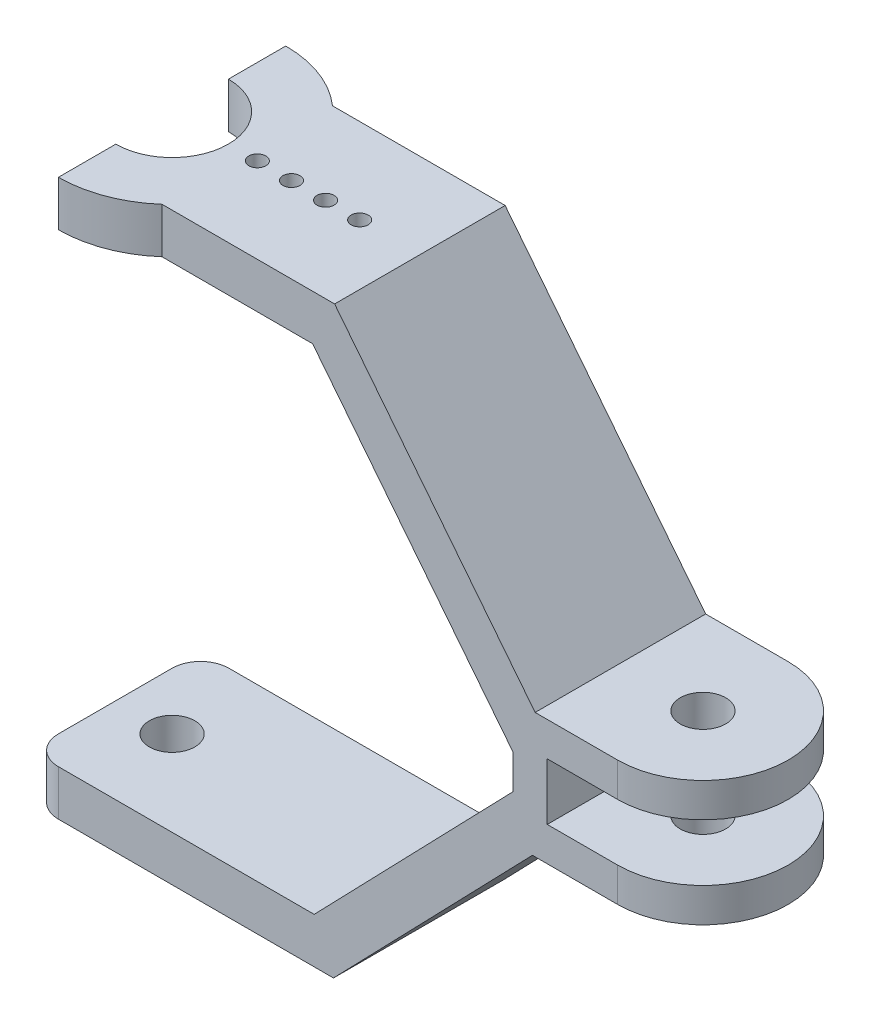
ISO-10303-21;
HEADER;
FILE_DESCRIPTION(('STEP AP214'),'2;1');
FILE_NAME('part.step','',(''),(''),'','','');
FILE_SCHEMA(('AUTOMOTIVE_DESIGN { 1 0 10303 214 1 1 1 1 }'));
ENDSEC;
DATA;
#1=APPLICATION_CONTEXT('core data for automotive mechanical design processes');
#2=APPLICATION_PROTOCOL_DEFINITION('international standard','automotive_design',2000,#1);
#3=PRODUCT_CONTEXT('',#1,'mechanical');
#4=PRODUCT('Part','Part','',(#3));
#5=PRODUCT_RELATED_PRODUCT_CATEGORY('part','',(#4));
#6=PRODUCT_DEFINITION_FORMATION('','',#4);
#7=PRODUCT_DEFINITION_CONTEXT('part definition',#1,'design');
#8=PRODUCT_DEFINITION('design','',#6,#7);
#9=PRODUCT_DEFINITION_SHAPE('','',#8);
#10=(LENGTH_UNIT() NAMED_UNIT(*) SI_UNIT(.MILLI.,.METRE.));
#11=(NAMED_UNIT(*) PLANE_ANGLE_UNIT() SI_UNIT($,.RADIAN.));
#12=(NAMED_UNIT(*) SI_UNIT($,.STERADIAN.) SOLID_ANGLE_UNIT());
#13=UNCERTAINTY_MEASURE_WITH_UNIT(LENGTH_MEASURE(1.E-05),#10,'distance_accuracy_value','');
#14=(GEOMETRIC_REPRESENTATION_CONTEXT(3) GLOBAL_UNCERTAINTY_ASSIGNED_CONTEXT((#13)) GLOBAL_UNIT_ASSIGNED_CONTEXT((#10,
#11,#12)) REPRESENTATION_CONTEXT('',''));
#15=CARTESIAN_POINT('',(0.,0.,0.));
#16=DIRECTION('',(0.,0.,1.));
#17=DIRECTION('',(1.,0.,0.));
#18=AXIS2_PLACEMENT_3D('',#15,#16,#17);
#19=CARTESIAN_POINT('',(-51.6964809757769,0.,15.));
#20=DIRECTION('',(1.,0.,0.));
#21=DIRECTION('',(0.,0.,-1.));
#22=AXIS2_PLACEMENT_3D('',#19,#20,#21);
#23=PLANE('',#22);
#24=DIRECTION('',(0.,0.,-1.));
#25=VECTOR('',#24,1.);
#26=CARTESIAN_POINT('',(-51.6964809757769,0.,15.));
#27=LINE('',#26,#25);
#28=CARTESIAN_POINT('',(-51.6964809757769,0.,12.5));
#29=VERTEX_POINT('',#28);
#30=CARTESIAN_POINT('',(-51.6964809757769,0.,2.5));
#31=VERTEX_POINT('',#30);
#32=EDGE_CURVE('E372',#29,#31,#27,.T.);
#33=ORIENTED_EDGE('',*,*,#32,.F.);
#34=DIRECTION('',(0.,-1.,0.));
#35=VECTOR('',#34,1.);
#36=CARTESIAN_POINT('',(-51.6964809757769,0.,12.5));
#37=LINE('',#36,#35);
#38=CARTESIAN_POINT('',(-51.6964809757769,3.99999999999999,12.5));
#39=VERTEX_POINT('',#38);
#40=EDGE_CURVE('E388',#29,#39,#37,.F.);
#41=ORIENTED_EDGE('',*,*,#40,.T.);
#42=DIRECTION('',(0.,0.,-1.));
#43=VECTOR('',#42,1.);
#44=CARTESIAN_POINT('',(-51.6964809757769,3.99999999999999,15.));
#45=LINE('',#44,#43);
#46=CARTESIAN_POINT('',(-51.6964809757769,3.99999999999999,2.5));
#47=VERTEX_POINT('',#46);
#48=EDGE_CURVE('E307',#39,#47,#45,.T.);
#49=ORIENTED_EDGE('',*,*,#48,.T.);
#50=DIRECTION('',(0.,-1.,0.));
#51=VECTOR('',#50,1.);
#52=CARTESIAN_POINT('',(-51.6964809757769,0.,2.5));
#53=LINE('',#52,#51);
#54=EDGE_CURVE('E385',#47,#31,#53,.T.);
#55=ORIENTED_EDGE('',*,*,#54,.T.);
#56=EDGE_LOOP('',(#33,#41,#49,#55));
#57=FACE_BOUND('',#56,.T.);
#58=ADVANCED_FACE('F35',(#57),#23,.F.);
#59=CARTESIAN_POINT('',(-25.,0.,15.));
#60=DIRECTION('',(0.,1.,0.));
#61=DIRECTION('',(-1.,0.,0.));
#62=AXIS2_PLACEMENT_3D('',#59,#60,#61);
#63=PLANE('',#62);
#64=CARTESIAN_POINT('',(-46.6964809757769,0.,7.5));
#65=DIRECTION('',(0.,-1.,0.));
#66=DIRECTION('',(1.,0.,0.));
#67=AXIS2_PLACEMENT_3D('',#64,#65,#66);
#68=CIRCLE('',#67,2.);
#69=CARTESIAN_POINT('',(-44.6964809757769,0.,7.5));
#70=VERTEX_POINT('',#69);
#71=EDGE_CURVE('E263',#70,#70,#68,.T.);
#72=ORIENTED_EDGE('',*,*,#71,.F.);
#73=EDGE_LOOP('',(#72));
#74=FACE_BOUND('',#73,.T.);
#75=DIRECTION('',(1.,0.,0.));
#76=VECTOR('',#75,1.);
#77=CARTESIAN_POINT('',(-25.,0.,15.));
#78=LINE('',#77,#76);
#79=CARTESIAN_POINT('',(-49.1964809757769,0.,15.));
#80=VERTEX_POINT('',#79);
#81=CARTESIAN_POINT('',(-25.,0.,15.));
#82=VERTEX_POINT('',#81);
#83=EDGE_CURVE('E272',#80,#82,#78,.T.);
#84=ORIENTED_EDGE('',*,*,#83,.F.);
#85=CARTESIAN_POINT('',(-49.1964809757769,0.,12.5));
#86=DIRECTION('',(0.,1.,0.));
#87=DIRECTION('',(-1.,0.,0.));
#88=AXIS2_PLACEMENT_3D('',#85,#86,#87);
#89=CIRCLE('',#88,2.5);
#90=EDGE_CURVE('E383',#80,#29,#89,.F.);
#91=ORIENTED_EDGE('',*,*,#90,.T.);
#92=ORIENTED_EDGE('',*,*,#32,.T.);
#93=CARTESIAN_POINT('',(-49.1964809757769,0.,2.5));
#94=DIRECTION('',(0.,1.,0.));
#95=DIRECTION('',(-1.,0.,0.));
#96=AXIS2_PLACEMENT_3D('',#93,#94,#95);
#97=CIRCLE('',#96,2.5);
#98=CARTESIAN_POINT('',(-49.1964809757769,0.,0.));
#99=VERTEX_POINT('',#98);
#100=EDGE_CURVE('E381',#31,#99,#97,.F.);
#101=ORIENTED_EDGE('',*,*,#100,.T.);
#102=DIRECTION('',(1.,0.,0.));
#103=VECTOR('',#102,1.);
#104=CARTESIAN_POINT('',(-25.,0.,0.));
#105=LINE('',#104,#103);
#106=CARTESIAN_POINT('',(-25.,0.,0.));
#107=VERTEX_POINT('',#106);
#108=EDGE_CURVE('E271',#99,#107,#105,.T.);
#109=ORIENTED_EDGE('',*,*,#108,.T.);
#110=DIRECTION('',(0.,0.,-1.));
#111=VECTOR('',#110,1.);
#112=CARTESIAN_POINT('',(-25.,0.,15.));
#113=LINE('',#112,#111);
#114=EDGE_CURVE('E369',#82,#107,#113,.T.);
#115=ORIENTED_EDGE('',*,*,#114,.F.);
#116=EDGE_LOOP('',(#84,#91,#92,#101,#109,#115));
#117=FACE_BOUND('',#116,.T.);
#118=ADVANCED_FACE('F404',(#74,#117),#63,.F.);
#119=CARTESIAN_POINT('',(-7.5,18.1,15.));
#120=DIRECTION('',(-0.718922211716419,0.695090536189907,0.));
#121=DIRECTION('',(-0.695090536189907,-0.718922211716419,0.));
#122=AXIS2_PLACEMENT_3D('',#119,#120,#121);
#123=PLANE('',#122);
#124=DIRECTION('',(0.695090536189907,0.718922211716419,0.));
#125=VECTOR('',#124,1.);
#126=CARTESIAN_POINT('',(-7.5,18.1,0.));
#127=LINE('',#126,#125);
#128=CARTESIAN_POINT('',(-7.5,18.1,0.));
#129=VERTEX_POINT('',#128);
#130=EDGE_CURVE('E309',#107,#129,#127,.T.);
#131=ORIENTED_EDGE('',*,*,#130,.T.);
#132=DIRECTION('',(0.,0.,-1.));
#133=VECTOR('',#132,1.);
#134=CARTESIAN_POINT('',(-7.5,18.1,15.));
#135=LINE('',#134,#133);
#136=CARTESIAN_POINT('',(-7.5,18.1,15.));
#137=VERTEX_POINT('',#136);
#138=EDGE_CURVE('E367',#137,#129,#135,.T.);
#139=ORIENTED_EDGE('',*,*,#138,.F.);
#140=DIRECTION('',(0.695090536189907,0.718922211716419,0.));
#141=VECTOR('',#140,1.);
#142=CARTESIAN_POINT('',(-7.5,18.1,15.));
#143=LINE('',#142,#141);
#144=EDGE_CURVE('E274',#82,#137,#143,.T.);
#145=ORIENTED_EDGE('',*,*,#144,.F.);
#146=ORIENTED_EDGE('',*,*,#114,.T.);
#147=EDGE_LOOP('',(#131,#139,#145,#146));
#148=FACE_BOUND('',#147,.T.);
#149=ADVANCED_FACE('F415',(#148),#123,.F.);
#150=CARTESIAN_POINT('',(-7.5,18.1,15.));
#151=DIRECTION('',(0.,1.,0.));
#152=DIRECTION('',(0.,0.,1.));
#153=AXIS2_PLACEMENT_3D('',#150,#151,#152);
#154=PLANE('',#153);
#155=CARTESIAN_POINT('',(0.,18.1,7.5));
#156=DIRECTION('',(0.,1.,0.));
#157=DIRECTION('',(0.,0.,1.));
#158=AXIS2_PLACEMENT_3D('',#155,#156,#157);
#159=CIRCLE('',#158,2.);
#160=CARTESIAN_POINT('',(0.,18.1,9.5));
#161=VERTEX_POINT('',#160);
#162=EDGE_CURVE('E242',#161,#161,#159,.T.);
#163=ORIENTED_EDGE('',*,*,#162,.T.);
#164=EDGE_LOOP('',(#163));
#165=FACE_BOUND('',#164,.T.);
#166=ORIENTED_EDGE('',*,*,#138,.T.);
#167=DIRECTION('',(1.,0.,0.));
#168=VECTOR('',#167,1.);
#169=CARTESIAN_POINT('',(-7.5,18.1,0.));
#170=LINE('',#169,#168);
#171=CARTESIAN_POINT('',(0.,18.1,0.));
#172=VERTEX_POINT('',#171);
#173=EDGE_CURVE('E312',#129,#172,#170,.T.);
#174=ORIENTED_EDGE('',*,*,#173,.T.);
#175=CARTESIAN_POINT('',(0.,18.1,7.5));
#176=DIRECTION('',(0.,-1.,0.));
#177=DIRECTION('',(0.,0.,-1.));
#178=AXIS2_PLACEMENT_3D('',#175,#176,#177);
#179=CIRCLE('',#178,7.5);
#180=CARTESIAN_POINT('',(0.,18.1,15.));
#181=VERTEX_POINT('',#180);
#182=EDGE_CURVE('E257',#172,#181,#179,.T.);
#183=ORIENTED_EDGE('',*,*,#182,.T.);
#184=DIRECTION('',(1.,0.,0.));
#185=VECTOR('',#184,1.);
#186=CARTESIAN_POINT('',(-7.5,18.1,15.));
#187=LINE('',#186,#185);
#188=EDGE_CURVE('E277',#137,#181,#187,.T.);
#189=ORIENTED_EDGE('',*,*,#188,.F.);
#190=EDGE_LOOP('',(#166,#174,#183,#189));
#191=FACE_BOUND('',#190,.T.);
#192=ADVANCED_FACE('F425',(#165,#191),#154,.F.);
#193=CARTESIAN_POINT('',(0.,21.1,15.));
#194=DIRECTION('',(0.,-1.,0.));
#195=DIRECTION('',(0.,0.,-1.));
#196=AXIS2_PLACEMENT_3D('',#193,#194,#195);
#197=PLANE('',#196);
#198=CARTESIAN_POINT('',(0.,21.1,7.5));
#199=DIRECTION('',(0.,-1.,0.));
#200=DIRECTION('',(0.,0.,-1.));
#201=AXIS2_PLACEMENT_3D('',#198,#199,#200);
#202=CIRCLE('',#201,2.);
#203=CARTESIAN_POINT('',(0.,21.1,5.5));
#204=VERTEX_POINT('',#203);
#205=EDGE_CURVE('E250',#204,#204,#202,.T.);
#206=ORIENTED_EDGE('',*,*,#205,.T.);
#207=EDGE_LOOP('',(#206));
#208=FACE_BOUND('',#207,.T.);
#209=DIRECTION('',(-1.,0.,0.));
#210=VECTOR('',#209,1.);
#211=CARTESIAN_POINT('',(0.,21.1,0.));
#212=LINE('',#211,#210);
#213=CARTESIAN_POINT('',(0.,21.1,0.));
#214=VERTEX_POINT('',#213);
#215=CARTESIAN_POINT('',(-6.19648097577692,21.1,0.));
#216=VERTEX_POINT('',#215);
#217=EDGE_CURVE('E317',#214,#216,#212,.T.);
#218=ORIENTED_EDGE('',*,*,#217,.T.);
#219=DIRECTION('',(0.,0.,-1.));
#220=VECTOR('',#219,1.);
#221=CARTESIAN_POINT('',(-6.19648097577692,21.1,15.));
#222=LINE('',#221,#220);
#223=CARTESIAN_POINT('',(-6.19648097577692,21.1,15.));
#224=VERTEX_POINT('',#223);
#225=EDGE_CURVE('E365',#224,#216,#222,.T.);
#226=ORIENTED_EDGE('',*,*,#225,.F.);
#227=DIRECTION('',(-1.,0.,0.));
#228=VECTOR('',#227,1.);
#229=CARTESIAN_POINT('',(0.,21.1,15.));
#230=LINE('',#229,#228);
#231=CARTESIAN_POINT('',(0.,21.1,15.));
#232=VERTEX_POINT('',#231);
#233=EDGE_CURVE('E281',#232,#224,#230,.T.);
#234=ORIENTED_EDGE('',*,*,#233,.F.);
#235=CARTESIAN_POINT('',(0.,21.1,7.5));
#236=DIRECTION('',(0.,-1.,0.));
#237=DIRECTION('',(0.,0.,-1.));
#238=AXIS2_PLACEMENT_3D('',#235,#236,#237);
#239=CIRCLE('',#238,7.5);
#240=EDGE_CURVE('E260',#214,#232,#239,.T.);
#241=ORIENTED_EDGE('',*,*,#240,.F.);
#242=EDGE_LOOP('',(#218,#226,#234,#241));
#243=FACE_BOUND('',#242,.T.);
#244=ADVANCED_FACE('F428',(#208,#243),#197,.F.);
#245=CARTESIAN_POINT('',(-6.19648097577692,26.1,15.));
#246=DIRECTION('',(-1.,0.,0.));
#247=DIRECTION('',(0.,-1.,0.));
#248=AXIS2_PLACEMENT_3D('',#245,#246,#247);
#249=PLANE('',#248);
#250=DIRECTION('',(0.,1.,0.));
#251=VECTOR('',#250,1.);
#252=CARTESIAN_POINT('',(-6.19648097577692,26.1,0.));
#253=LINE('',#252,#251);
#254=CARTESIAN_POINT('',(-6.19648097577692,26.1,0.));
#255=VERTEX_POINT('',#254);
#256=EDGE_CURVE('E320',#216,#255,#253,.T.);
#257=ORIENTED_EDGE('',*,*,#256,.T.);
#258=DIRECTION('',(0.,0.,-1.));
#259=VECTOR('',#258,1.);
#260=CARTESIAN_POINT('',(-6.19648097577692,26.1,15.));
#261=LINE('',#260,#259);
#262=CARTESIAN_POINT('',(-6.19648097577692,26.1,15.));
#263=VERTEX_POINT('',#262);
#264=EDGE_CURVE('E363',#263,#255,#261,.T.);
#265=ORIENTED_EDGE('',*,*,#264,.F.);
#266=DIRECTION('',(0.,1.,0.));
#267=VECTOR('',#266,1.);
#268=CARTESIAN_POINT('',(-6.19648097577692,26.1,15.));
#269=LINE('',#268,#267);
#270=EDGE_CURVE('E283',#224,#263,#269,.T.);
#271=ORIENTED_EDGE('',*,*,#270,.F.);
#272=ORIENTED_EDGE('',*,*,#225,.T.);
#273=EDGE_LOOP('',(#257,#265,#271,#272));
#274=FACE_BOUND('',#273,.T.);
#275=ADVANCED_FACE('F435',(#274),#249,.F.);
#276=CARTESIAN_POINT('',(0.,26.1,15.));
#277=DIRECTION('',(0.,1.,0.));
#278=DIRECTION('',(-1.,0.,0.));
#279=AXIS2_PLACEMENT_3D('',#276,#277,#278);
#280=PLANE('',#279);
#281=CARTESIAN_POINT('',(0.,26.1,7.5));
#282=DIRECTION('',(0.,1.,0.));
#283=DIRECTION('',(-1.,0.,0.));
#284=AXIS2_PLACEMENT_3D('',#281,#282,#283);
#285=CIRCLE('',#284,2.);
#286=CARTESIAN_POINT('',(-2.,26.1,7.5));
#287=VERTEX_POINT('',#286);
#288=EDGE_CURVE('E245',#287,#287,#285,.T.);
#289=ORIENTED_EDGE('',*,*,#288,.T.);
#290=EDGE_LOOP('',(#289));
#291=FACE_BOUND('',#290,.T.);
#292=DIRECTION('',(1.,0.,0.));
#293=VECTOR('',#292,1.);
#294=CARTESIAN_POINT('',(0.,26.1,0.));
#295=LINE('',#294,#293);
#296=CARTESIAN_POINT('',(0.,26.1,0.));
#297=VERTEX_POINT('',#296);
#298=EDGE_CURVE('E323',#255,#297,#295,.T.);
#299=ORIENTED_EDGE('',*,*,#298,.T.);
#300=CARTESIAN_POINT('',(0.,26.1,7.5));
#301=DIRECTION('',(0.,1.,0.));
#302=DIRECTION('',(0.,0.,1.));
#303=AXIS2_PLACEMENT_3D('',#300,#301,#302);
#304=CIRCLE('',#303,7.5);
#305=CARTESIAN_POINT('',(0.,26.1,15.));
#306=VERTEX_POINT('',#305);
#307=EDGE_CURVE('E254',#306,#297,#304,.T.);
#308=ORIENTED_EDGE('',*,*,#307,.F.);
#309=DIRECTION('',(1.,0.,0.));
#310=VECTOR('',#309,1.);
#311=CARTESIAN_POINT('',(0.,26.1,15.));
#312=LINE('',#311,#310);
#313=EDGE_CURVE('E285',#263,#306,#312,.T.);
#314=ORIENTED_EDGE('',*,*,#313,.F.);
#315=ORIENTED_EDGE('',*,*,#264,.T.);
#316=EDGE_LOOP('',(#299,#308,#314,#315));
#317=FACE_BOUND('',#316,.T.);
#318=ADVANCED_FACE('F439',(#291,#317),#280,.F.);
#319=CARTESIAN_POINT('',(-7.26033434363422,29.1,15.));
#320=DIRECTION('',(0.,-1.,0.));
#321=DIRECTION('',(0.,0.,-1.));
#322=AXIS2_PLACEMENT_3D('',#319,#320,#321);
#323=PLANE('',#322);
#324=CARTESIAN_POINT('',(0.,29.1,7.5));
#325=DIRECTION('',(0.,1.,0.));
#326=DIRECTION('',(0.,0.,1.));
#327=AXIS2_PLACEMENT_3D('',#324,#325,#326);
#328=CIRCLE('',#327,2.);
#329=CARTESIAN_POINT('',(0.,29.1,9.5));
#330=VERTEX_POINT('',#329);
#331=EDGE_CURVE('E241',#330,#330,#328,.T.);
#332=ORIENTED_EDGE('',*,*,#331,.F.);
#333=EDGE_LOOP('',(#332));
#334=FACE_BOUND('',#333,.T.);
#335=DIRECTION('',(-1.,0.,0.));
#336=VECTOR('',#335,1.);
#337=CARTESIAN_POINT('',(-7.26033434363422,29.1,0.));
#338=LINE('',#337,#336);
#339=CARTESIAN_POINT('',(0.,29.1,0.));
#340=VERTEX_POINT('',#339);
#341=CARTESIAN_POINT('',(-7.26033434363422,29.1,0.));
#342=VERTEX_POINT('',#341);
#343=EDGE_CURVE('E328',#340,#342,#338,.T.);
#344=ORIENTED_EDGE('',*,*,#343,.T.);
#345=DIRECTION('',(0.,0.,-1.));
#346=VECTOR('',#345,1.);
#347=CARTESIAN_POINT('',(-7.26033434363422,29.1,15.));
#348=LINE('',#347,#346);
#349=CARTESIAN_POINT('',(-7.26033434363422,29.1,15.));
#350=VERTEX_POINT('',#349);
#351=EDGE_CURVE('E361',#350,#342,#348,.T.);
#352=ORIENTED_EDGE('',*,*,#351,.F.);
#353=DIRECTION('',(-1.,0.,0.));
#354=VECTOR('',#353,1.);
#355=CARTESIAN_POINT('',(-7.26033434363422,29.1,15.));
#356=LINE('',#355,#354);
#357=CARTESIAN_POINT('',(0.,29.1,15.));
#358=VERTEX_POINT('',#357);
#359=EDGE_CURVE('E289',#358,#350,#356,.T.);
#360=ORIENTED_EDGE('',*,*,#359,.F.);
#361=CARTESIAN_POINT('',(0.,29.1,7.5));
#362=DIRECTION('',(0.,1.,0.));
#363=DIRECTION('',(0.,0.,1.));
#364=AXIS2_PLACEMENT_3D('',#361,#362,#363);
#365=CIRCLE('',#364,7.5);
#366=EDGE_CURVE('E253',#358,#340,#365,.T.);
#367=ORIENTED_EDGE('',*,*,#366,.T.);
#368=EDGE_LOOP('',(#344,#352,#360,#367));
#369=FACE_BOUND('',#368,.T.);
#370=ADVANCED_FACE('F447',(#334,#369),#323,.F.);
#371=CARTESIAN_POINT('',(-24.8987709904648,51.4,15.));
#372=DIRECTION('',(-0.784314991068917,-0.620362792875721,0.));
#373=DIRECTION('',(0.620362792875721,-0.784314991068917,0.));
#374=AXIS2_PLACEMENT_3D('',#371,#372,#373);
#375=PLANE('',#374);
#376=DIRECTION('',(-0.620362792875721,0.784314991068917,0.));
#377=VECTOR('',#376,1.);
#378=CARTESIAN_POINT('',(-24.8987709904648,51.4,0.));
#379=LINE('',#378,#377);
#380=CARTESIAN_POINT('',(-24.8987709904648,51.4,0.));
#381=VERTEX_POINT('',#380);
#382=EDGE_CURVE('E331',#342,#381,#379,.T.);
#383=ORIENTED_EDGE('',*,*,#382,.T.);
#384=DIRECTION('',(0.,0.,-1.));
#385=VECTOR('',#384,1.);
#386=CARTESIAN_POINT('',(-24.8987709904648,51.4,15.));
#387=LINE('',#386,#385);
#388=CARTESIAN_POINT('',(-24.8987709904648,51.4,15.));
#389=VERTEX_POINT('',#388);
#390=EDGE_CURVE('E358',#389,#381,#387,.T.);
#391=ORIENTED_EDGE('',*,*,#390,.F.);
#392=DIRECTION('',(-0.620362792875721,0.784314991068917,0.));
#393=VECTOR('',#392,1.);
#394=CARTESIAN_POINT('',(-24.8987709904648,51.4,15.));
#395=LINE('',#394,#393);
#396=EDGE_CURVE('E291',#350,#389,#395,.T.);
#397=ORIENTED_EDGE('',*,*,#396,.F.);
#398=ORIENTED_EDGE('',*,*,#351,.T.);
#399=EDGE_LOOP('',(#383,#391,#397,#398));
#400=FACE_BOUND('',#399,.T.);
#401=ADVANCED_FACE('F452',(#400),#375,.F.);
#402=CARTESIAN_POINT('',(-24.8987709904648,51.4,15.));
#403=DIRECTION('',(0.,-1.,0.));
#404=DIRECTION('',(0.,0.,-1.));
#405=AXIS2_PLACEMENT_3D('',#402,#403,#404);
#406=PLANE('',#405);
#407=CARTESIAN_POINT('',(-36.1964809726075,51.4,7.5));
#408=DIRECTION('',(0.,1.,0.));
#409=DIRECTION('',(-1.,0.,0.));
#410=AXIS2_PLACEMENT_3D('',#407,#408,#409);
#411=CIRCLE('',#410,0.749999999999999);
#412=CARTESIAN_POINT('',(-36.9464809726075,51.4,7.5));
#413=VERTEX_POINT('',#412);
#414=EDGE_CURVE('E836',#413,#413,#411,.T.);
#415=ORIENTED_EDGE('',*,*,#414,.F.);
#416=EDGE_LOOP('',(#415));
#417=FACE_BOUND('',#416,.T.);
#418=CARTESIAN_POINT('',(-33.1964809726075,51.4,7.5));
#419=DIRECTION('',(0.,1.,0.));
#420=DIRECTION('',(-1.,0.,0.));
#421=AXIS2_PLACEMENT_3D('',#418,#419,#420);
#422=CIRCLE('',#421,0.749999999999999);
#423=CARTESIAN_POINT('',(-33.9464809726075,51.4,7.5));
#424=VERTEX_POINT('',#423);
#425=EDGE_CURVE('E840',#424,#424,#422,.T.);
#426=ORIENTED_EDGE('',*,*,#425,.F.);
#427=EDGE_LOOP('',(#426));
#428=FACE_BOUND('',#427,.T.);
#429=CARTESIAN_POINT('',(-30.1964809726075,51.4,7.5));
#430=DIRECTION('',(0.,1.,0.));
#431=DIRECTION('',(-1.,0.,0.));
#432=AXIS2_PLACEMENT_3D('',#429,#430,#431);
#433=CIRCLE('',#432,0.750000000000002);
#434=CARTESIAN_POINT('',(-30.9464809726075,51.4,7.5));
#435=VERTEX_POINT('',#434);
#436=EDGE_CURVE('E844',#435,#435,#433,.T.);
#437=ORIENTED_EDGE('',*,*,#436,.F.);
#438=EDGE_LOOP('',(#437));
#439=FACE_BOUND('',#438,.T.);
#440=CARTESIAN_POINT('',(-39.1964809726075,51.4,7.5));
#441=DIRECTION('',(0.,1.,0.));
#442=DIRECTION('',(-1.,0.,0.));
#443=AXIS2_PLACEMENT_3D('',#440,#441,#442);
#444=CIRCLE('',#443,0.749999999999999);
#445=CARTESIAN_POINT('',(-39.9464809726075,51.4,7.5));
#446=VERTEX_POINT('',#445);
#447=EDGE_CURVE('E464',#446,#446,#444,.T.);
#448=ORIENTED_EDGE('',*,*,#447,.F.);
#449=EDGE_LOOP('',(#448));
#450=FACE_BOUND('',#449,.T.);
#451=DIRECTION('',(-1.,0.,0.));
#452=VECTOR('',#451,1.);
#453=CARTESIAN_POINT('',(-24.8987709904648,51.4,0.));
#454=LINE('',#453,#452);
#455=CARTESIAN_POINT('',(-40.082102694946,51.4,0.));
#456=VERTEX_POINT('',#455);
#457=EDGE_CURVE('E333',#381,#456,#454,.T.);
#458=ORIENTED_EDGE('',*,*,#457,.T.);
#459=CARTESIAN_POINT('',(-46.6964809726075,51.4,7.5));
#460=DIRECTION('',(0.,1.,0.));
#461=DIRECTION('',(0.,0.,1.));
#462=AXIS2_PLACEMENT_3D('',#459,#460,#461);
#463=CIRCLE('',#462,10.);
#464=CARTESIAN_POINT('',(-46.6964809726075,51.4,-2.5));
#465=VERTEX_POINT('',#464);
#466=EDGE_CURVE('E222',#456,#465,#463,.T.);
#467=ORIENTED_EDGE('',*,*,#466,.T.);
#468=DIRECTION('',(0.,0.,1.));
#469=VECTOR('',#468,1.);
#470=CARTESIAN_POINT('',(-46.6964809726075,51.4,-2.5));
#471=LINE('',#470,#469);
#472=CARTESIAN_POINT('',(-46.6964809726075,51.4,2.54999999999999));
#473=VERTEX_POINT('',#472);
#474=EDGE_CURVE('E204',#465,#473,#471,.T.);
#475=ORIENTED_EDGE('',*,*,#474,.T.);
#476=CARTESIAN_POINT('',(-46.6964809726075,51.4,7.5));
#477=DIRECTION('',(0.,-1.,0.));
#478=DIRECTION('',(0.,0.,1.));
#479=AXIS2_PLACEMENT_3D('',#476,#477,#478);
#480=CIRCLE('',#479,4.95000000000001);
#481=CARTESIAN_POINT('',(-46.6964809726075,51.4,12.45));
#482=VERTEX_POINT('',#481);
#483=EDGE_CURVE('E196',#473,#482,#480,.T.);
#484=ORIENTED_EDGE('',*,*,#483,.T.);
#485=DIRECTION('',(0.,0.,1.));
#486=VECTOR('',#485,1.);
#487=CARTESIAN_POINT('',(-46.6964809726075,51.4,12.45));
#488=LINE('',#487,#486);
#489=CARTESIAN_POINT('',(-46.6964809726075,51.4,17.5));
#490=VERTEX_POINT('',#489);
#491=EDGE_CURVE('E202',#482,#490,#488,.T.);
#492=ORIENTED_EDGE('',*,*,#491,.T.);
#493=CARTESIAN_POINT('',(-40.082102694946,51.4,15.));
#494=VERTEX_POINT('',#493);
#495=EDGE_CURVE('E224',#490,#494,#463,.T.);
#496=ORIENTED_EDGE('',*,*,#495,.T.);
#497=DIRECTION('',(-1.,0.,0.));
#498=VECTOR('',#497,1.);
#499=CARTESIAN_POINT('',(-24.8987709904648,51.4,15.));
#500=LINE('',#499,#498);
#501=EDGE_CURVE('E293',#389,#494,#500,.T.);
#502=ORIENTED_EDGE('',*,*,#501,.F.);
#503=ORIENTED_EDGE('',*,*,#390,.T.);
#504=EDGE_LOOP('',(#458,#467,#475,#484,#492,#496,#502,#503));
#505=FACE_BOUND('',#504,.T.);
#506=ADVANCED_FACE('F199',(#417,#428,#439,#450,#505),#406,.F.);
#507=CARTESIAN_POINT('',(-41.7464809726075,47.4,15.));
#508=DIRECTION('',(0.,1.,0.));
#509=DIRECTION('',(0.,0.,1.));
#510=AXIS2_PLACEMENT_3D('',#507,#508,#509);
#511=PLANE('',#510);
#512=CARTESIAN_POINT('',(-46.6964809726075,47.4,7.5));
#513=DIRECTION('',(0.,1.,0.));
#514=DIRECTION('',(0.,0.,1.));
#515=AXIS2_PLACEMENT_3D('',#512,#513,#514);
#516=CIRCLE('',#515,4.95000000000001);
#517=CARTESIAN_POINT('',(-46.6964809726075,47.4,12.45));
#518=VERTEX_POINT('',#517);
#519=CARTESIAN_POINT('',(-46.6964809726075,47.4,2.54999999999999));
#520=VERTEX_POINT('',#519);
#521=EDGE_CURVE('E214',#518,#520,#516,.T.);
#522=ORIENTED_EDGE('',*,*,#521,.T.);
#523=DIRECTION('',(0.,0.,-1.));
#524=VECTOR('',#523,1.);
#525=CARTESIAN_POINT('',(-46.6964809726075,47.4,-2.5));
#526=LINE('',#525,#524);
#527=CARTESIAN_POINT('',(-46.6964809726075,47.4,-2.5));
#528=VERTEX_POINT('',#527);
#529=EDGE_CURVE('E461',#520,#528,#526,.T.);
#530=ORIENTED_EDGE('',*,*,#529,.T.);
#531=CARTESIAN_POINT('',(-46.6964809726075,47.4,7.5));
#532=DIRECTION('',(0.,1.,0.));
#533=DIRECTION('',(0.,0.,1.));
#534=AXIS2_PLACEMENT_3D('',#531,#532,#533);
#535=CIRCLE('',#534,10.);
#536=CARTESIAN_POINT('',(-40.082102694946,47.4,0.));
#537=VERTEX_POINT('',#536);
#538=EDGE_CURVE('E459',#528,#537,#535,.F.);
#539=ORIENTED_EDGE('',*,*,#538,.T.);
#540=DIRECTION('',(1.,0.,0.));
#541=VECTOR('',#540,1.);
#542=CARTESIAN_POINT('',(-41.7464809726075,47.4,0.));
#543=LINE('',#542,#541);
#544=CARTESIAN_POINT('',(-26.8349176226075,47.4,0.));
#545=VERTEX_POINT('',#544);
#546=EDGE_CURVE('E335',#537,#545,#543,.T.);
#547=ORIENTED_EDGE('',*,*,#546,.T.);
#548=DIRECTION('',(0.,0.,-1.));
#549=VECTOR('',#548,1.);
#550=CARTESIAN_POINT('',(-26.8349176226075,47.4,15.));
#551=LINE('',#550,#549);
#552=CARTESIAN_POINT('',(-26.8349176226075,47.4,15.));
#553=VERTEX_POINT('',#552);
#554=EDGE_CURVE('E355',#553,#545,#551,.T.);
#555=ORIENTED_EDGE('',*,*,#554,.F.);
#556=DIRECTION('',(1.,0.,0.));
#557=VECTOR('',#556,1.);
#558=CARTESIAN_POINT('',(-41.7464809726075,47.4,15.));
#559=LINE('',#558,#557);
#560=CARTESIAN_POINT('',(-40.082102694946,47.4,15.));
#561=VERTEX_POINT('',#560);
#562=EDGE_CURVE('E296',#561,#553,#559,.T.);
#563=ORIENTED_EDGE('',*,*,#562,.F.);
#564=CARTESIAN_POINT('',(-46.6964809726075,47.4,17.5));
#565=VERTEX_POINT('',#564);
#566=EDGE_CURVE('E231',#561,#565,#535,.F.);
#567=ORIENTED_EDGE('',*,*,#566,.T.);
#568=DIRECTION('',(0.,0.,-1.));
#569=VECTOR('',#568,1.);
#570=CARTESIAN_POINT('',(-46.6964809726075,47.4,12.45));
#571=LINE('',#570,#569);
#572=EDGE_CURVE('E236',#565,#518,#571,.T.);
#573=ORIENTED_EDGE('',*,*,#572,.T.);
#574=EDGE_LOOP('',(#522,#530,#539,#547,#555,#563,#567,#573));
#575=FACE_BOUND('',#574,.T.);
#576=ADVANCED_FACE('F467',(#575),#511,.F.);
#577=CARTESIAN_POINT('',(-16.9815707289928,34.9425673982795,15.));
#578=DIRECTION('',(0.784314991068917,0.620362792875721,0.));
#579=DIRECTION('',(-0.620362792875721,0.784314991068917,0.));
#580=AXIS2_PLACEMENT_3D('',#577,#578,#579);
#581=PLANE('',#580);
#582=DIRECTION('',(0.620362792875721,-0.784314991068917,0.));
#583=VECTOR('',#582,1.);
#584=CARTESIAN_POINT('',(-16.9815707289928,34.9425673982795,0.));
#585=LINE('',#584,#583);
#586=CARTESIAN_POINT('',(-9.19648097577691,25.1,0.));
#587=VERTEX_POINT('',#586);
#588=EDGE_CURVE('E337',#545,#587,#585,.T.);
#589=ORIENTED_EDGE('',*,*,#588,.T.);
#590=DIRECTION('',(0.,0.,-1.));
#591=VECTOR('',#590,1.);
#592=CARTESIAN_POINT('',(-9.19648097577691,25.1,15.));
#593=LINE('',#592,#591);
#594=CARTESIAN_POINT('',(-9.19648097577691,25.1,15.));
#595=VERTEX_POINT('',#594);
#596=EDGE_CURVE('E352',#595,#587,#593,.T.);
#597=ORIENTED_EDGE('',*,*,#596,.F.);
#598=DIRECTION('',(0.620362792875721,-0.784314991068917,0.));
#599=VECTOR('',#598,1.);
#600=CARTESIAN_POINT('',(-16.9815707289928,34.9425673982795,15.));
#601=LINE('',#600,#599);
#602=EDGE_CURVE('E298',#553,#595,#601,.T.);
#603=ORIENTED_EDGE('',*,*,#602,.F.);
#604=ORIENTED_EDGE('',*,*,#554,.T.);
#605=EDGE_LOOP('',(#589,#597,#603,#604));
#606=FACE_BOUND('',#605,.T.);
#607=ADVANCED_FACE('F483',(#606),#581,.F.);
#608=CARTESIAN_POINT('',(-9.19648097577691,25.1,15.));
#609=DIRECTION('',(1.,0.,0.));
#610=DIRECTION('',(0.,1.,0.));
#611=AXIS2_PLACEMENT_3D('',#608,#609,#610);
#612=PLANE('',#611);
#613=DIRECTION('',(0.,-1.,0.));
#614=VECTOR('',#613,1.);
#615=CARTESIAN_POINT('',(-9.19648097577691,25.1,0.));
#616=LINE('',#615,#614);
#617=CARTESIAN_POINT('',(-9.19648097577692,22.1,0.));
#618=VERTEX_POINT('',#617);
#619=EDGE_CURVE('E339',#587,#618,#616,.T.);
#620=ORIENTED_EDGE('',*,*,#619,.T.);
#621=DIRECTION('',(0.,0.,-1.));
#622=VECTOR('',#621,1.);
#623=CARTESIAN_POINT('',(-9.19648097577692,22.1,15.));
#624=LINE('',#623,#622);
#625=CARTESIAN_POINT('',(-9.19648097577692,22.1,15.));
#626=VERTEX_POINT('',#625);
#627=EDGE_CURVE('E349',#626,#618,#624,.T.);
#628=ORIENTED_EDGE('',*,*,#627,.F.);
#629=DIRECTION('',(0.,-1.,0.));
#630=VECTOR('',#629,1.);
#631=CARTESIAN_POINT('',(-9.19648097577691,25.1,15.));
#632=LINE('',#631,#630);
#633=EDGE_CURVE('E300',#595,#626,#632,.T.);
#634=ORIENTED_EDGE('',*,*,#633,.F.);
#635=ORIENTED_EDGE('',*,*,#596,.T.);
#636=EDGE_LOOP('',(#620,#628,#634,#635));
#637=FACE_BOUND('',#636,.T.);
#638=ADVANCED_FACE('F487',(#637),#612,.F.);
#639=CARTESIAN_POINT('',(-9.19648097577692,22.1,15.));
#640=DIRECTION('',(0.718922211716419,-0.695090536189907,0.));
#641=DIRECTION('',(0.695090536189907,0.718922211716419,0.));
#642=AXIS2_PLACEMENT_3D('',#639,#640,#641);
#643=PLANE('',#642);
#644=DIRECTION('',(-0.695090536189907,-0.718922211716419,0.));
#645=VECTOR('',#644,1.);
#646=CARTESIAN_POINT('',(-9.19648097577692,22.1,0.));
#647=LINE('',#646,#645);
#648=CARTESIAN_POINT('',(-26.6964809757769,4.,0.));
#649=VERTEX_POINT('',#648);
#650=EDGE_CURVE('E341',#618,#649,#647,.T.);
#651=ORIENTED_EDGE('',*,*,#650,.T.);
#652=DIRECTION('',(0.,0.,-1.));
#653=VECTOR('',#652,1.);
#654=CARTESIAN_POINT('',(-26.6964809757769,4.,15.));
#655=LINE('',#654,#653);
#656=CARTESIAN_POINT('',(-26.6964809757769,4.,15.));
#657=VERTEX_POINT('',#656);
#658=EDGE_CURVE('E346',#657,#649,#655,.T.);
#659=ORIENTED_EDGE('',*,*,#658,.F.);
#660=DIRECTION('',(-0.695090536189907,-0.718922211716419,0.));
#661=VECTOR('',#660,1.);
#662=CARTESIAN_POINT('',(-9.19648097577692,22.1,15.));
#663=LINE('',#662,#661);
#664=EDGE_CURVE('E302',#626,#657,#663,.T.);
#665=ORIENTED_EDGE('',*,*,#664,.F.);
#666=ORIENTED_EDGE('',*,*,#627,.T.);
#667=EDGE_LOOP('',(#651,#659,#665,#666));
#668=FACE_BOUND('',#667,.T.);
#669=ADVANCED_FACE('F489',(#668),#643,.F.);
#670=CARTESIAN_POINT('',(-51.6964809757769,3.99999999999999,15.));
#671=DIRECTION('',(0.,-1.,0.));
#672=DIRECTION('',(0.,0.,-1.));
#673=AXIS2_PLACEMENT_3D('',#670,#671,#672);
#674=PLANE('',#673);
#675=CARTESIAN_POINT('',(-46.6964809757769,3.99999999999999,7.5));
#676=DIRECTION('',(0.,-1.,0.));
#677=DIRECTION('',(0.,0.,-1.));
#678=AXIS2_PLACEMENT_3D('',#675,#676,#677);
#679=CIRCLE('',#678,2.);
#680=CARTESIAN_POINT('',(-46.6964809757769,3.99999999999999,5.5));
#681=VERTEX_POINT('',#680);
#682=EDGE_CURVE('E268',#681,#681,#679,.F.);
#683=ORIENTED_EDGE('',*,*,#682,.F.);
#684=EDGE_LOOP('',(#683));
#685=FACE_BOUND('',#684,.T.);
#686=ORIENTED_EDGE('',*,*,#48,.F.);
#687=CARTESIAN_POINT('',(-49.1964809757769,3.99999999999999,12.5));
#688=DIRECTION('',(0.,-1.,0.));
#689=DIRECTION('',(0.,0.,-1.));
#690=AXIS2_PLACEMENT_3D('',#687,#688,#689);
#691=CIRCLE('',#690,2.5);
#692=CARTESIAN_POINT('',(-49.1964809757769,3.99999999999999,15.));
#693=VERTEX_POINT('',#692);
#694=EDGE_CURVE('E43',#39,#693,#691,.F.);
#695=ORIENTED_EDGE('',*,*,#694,.T.);
#696=DIRECTION('',(-1.,0.,0.));
#697=VECTOR('',#696,1.);
#698=CARTESIAN_POINT('',(-26.6964809757769,4.,15.));
#699=LINE('',#698,#697);
#700=EDGE_CURVE('E304',#657,#693,#699,.T.);
#701=ORIENTED_EDGE('',*,*,#700,.F.);
#702=ORIENTED_EDGE('',*,*,#658,.T.);
#703=DIRECTION('',(-1.,0.,0.));
#704=VECTOR('',#703,1.);
#705=CARTESIAN_POINT('',(-51.6964809757769,3.99999999999999,0.));
#706=LINE('',#705,#704);
#707=CARTESIAN_POINT('',(-49.1964809757769,3.99999999999999,0.));
#708=VERTEX_POINT('',#707);
#709=EDGE_CURVE('E275',#649,#708,#706,.T.);
#710=ORIENTED_EDGE('',*,*,#709,.T.);
#711=CARTESIAN_POINT('',(-49.1964809757769,3.99999999999999,2.5));
#712=DIRECTION('',(0.,-1.,0.));
#713=DIRECTION('',(0.,0.,-1.));
#714=AXIS2_PLACEMENT_3D('',#711,#712,#713);
#715=CIRCLE('',#714,2.5);
#716=EDGE_CURVE('E55',#708,#47,#715,.F.);
#717=ORIENTED_EDGE('',*,*,#716,.T.);
#718=EDGE_LOOP('',(#686,#695,#701,#702,#710,#717));
#719=FACE_BOUND('',#718,.T.);
#720=ADVANCED_FACE('F392',(#685,#719),#674,.F.);
#721=CARTESIAN_POINT('',(0.,0.,15.));
#722=DIRECTION('',(0.,0.,-1.));
#723=DIRECTION('',(-1.,0.,0.));
#724=AXIS2_PLACEMENT_3D('',#721,#722,#723);
#725=PLANE('',#724);
#726=ORIENTED_EDGE('',*,*,#700,.T.);
#727=DIRECTION('',(0.,-1.,0.));
#728=VECTOR('',#727,1.);
#729=CARTESIAN_POINT('',(-49.1964809757769,0.,15.));
#730=LINE('',#729,#728);
#731=EDGE_CURVE('E378',#693,#80,#730,.T.);
#732=ORIENTED_EDGE('',*,*,#731,.T.);
#733=ORIENTED_EDGE('',*,*,#83,.T.);
#734=ORIENTED_EDGE('',*,*,#144,.T.);
#735=ORIENTED_EDGE('',*,*,#188,.T.);
#736=DIRECTION('',(0.,1.,0.));
#737=VECTOR('',#736,1.);
#738=CARTESIAN_POINT('',(0.,18.1,15.));
#739=LINE('',#738,#737);
#740=EDGE_CURVE('E279',#181,#232,#739,.T.);
#741=ORIENTED_EDGE('',*,*,#740,.T.);
#742=ORIENTED_EDGE('',*,*,#233,.T.);
#743=ORIENTED_EDGE('',*,*,#270,.T.);
#744=ORIENTED_EDGE('',*,*,#313,.T.);
#745=DIRECTION('',(0.,1.,0.));
#746=VECTOR('',#745,1.);
#747=CARTESIAN_POINT('',(0.,26.1,15.));
#748=LINE('',#747,#746);
#749=EDGE_CURVE('E287',#306,#358,#748,.T.);
#750=ORIENTED_EDGE('',*,*,#749,.T.);
#751=ORIENTED_EDGE('',*,*,#359,.T.);
#752=ORIENTED_EDGE('',*,*,#396,.T.);
#753=ORIENTED_EDGE('',*,*,#501,.T.);
#754=DIRECTION('',(0.,1.,0.));
#755=VECTOR('',#754,1.);
#756=CARTESIAN_POINT('',(-40.082102694946,25.0393202250021,15.));
#757=LINE('',#756,#755);
#758=EDGE_CURVE('E238',#494,#561,#757,.F.);
#759=ORIENTED_EDGE('',*,*,#758,.T.);
#760=ORIENTED_EDGE('',*,*,#562,.T.);
#761=ORIENTED_EDGE('',*,*,#602,.T.);
#762=ORIENTED_EDGE('',*,*,#633,.T.);
#763=ORIENTED_EDGE('',*,*,#664,.T.);
#764=EDGE_LOOP('',(#726,#732,#733,#734,#735,#741,#742,#743,#744,#750,#751,#752,#753,#759,#760,
#761,#762,#763));
#765=FACE_BOUND('',#764,.T.);
#766=ADVANCED_FACE('F397',(#765),#725,.F.);
#767=CARTESIAN_POINT('',(0.,0.,0.));
#768=DIRECTION('',(0.,0.,-1.));
#769=DIRECTION('',(-1.,0.,0.));
#770=AXIS2_PLACEMENT_3D('',#767,#768,#769);
#771=PLANE('',#770);
#772=ORIENTED_EDGE('',*,*,#108,.F.);
#773=DIRECTION('',(0.,-1.,0.));
#774=VECTOR('',#773,1.);
#775=CARTESIAN_POINT('',(-49.1964809757769,3.99999999999999,0.));
#776=LINE('',#775,#774);
#777=EDGE_CURVE('E11',#99,#708,#776,.F.);
#778=ORIENTED_EDGE('',*,*,#777,.T.);
#779=ORIENTED_EDGE('',*,*,#709,.F.);
#780=ORIENTED_EDGE('',*,*,#650,.F.);
#781=ORIENTED_EDGE('',*,*,#619,.F.);
#782=ORIENTED_EDGE('',*,*,#588,.F.);
#783=ORIENTED_EDGE('',*,*,#546,.F.);
#784=DIRECTION('',(0.,1.,0.));
#785=VECTOR('',#784,1.);
#786=CARTESIAN_POINT('',(-40.082102694946,25.0393202250021,0.));
#787=LINE('',#786,#785);
#788=EDGE_CURVE('E375',#456,#537,#787,.F.);
#789=ORIENTED_EDGE('',*,*,#788,.F.);
#790=ORIENTED_EDGE('',*,*,#457,.F.);
#791=ORIENTED_EDGE('',*,*,#382,.F.);
#792=ORIENTED_EDGE('',*,*,#343,.F.);
#793=DIRECTION('',(0.,1.,0.));
#794=VECTOR('',#793,1.);
#795=CARTESIAN_POINT('',(0.,26.1,0.));
#796=LINE('',#795,#794);
#797=EDGE_CURVE('E325',#297,#340,#796,.T.);
#798=ORIENTED_EDGE('',*,*,#797,.F.);
#799=ORIENTED_EDGE('',*,*,#298,.F.);
#800=ORIENTED_EDGE('',*,*,#256,.F.);
#801=ORIENTED_EDGE('',*,*,#217,.F.);
#802=DIRECTION('',(0.,1.,0.));
#803=VECTOR('',#802,1.);
#804=CARTESIAN_POINT('',(0.,18.1,0.));
#805=LINE('',#804,#803);
#806=EDGE_CURVE('E314',#172,#214,#805,.T.);
#807=ORIENTED_EDGE('',*,*,#806,.F.);
#808=ORIENTED_EDGE('',*,*,#173,.F.);
#809=ORIENTED_EDGE('',*,*,#130,.F.);
#810=EDGE_LOOP('',(#772,#778,#779,#780,#781,#782,#783,#789,#790,#791,#792,#798,#799,#800,#801,
#807,#808,#809));
#811=FACE_BOUND('',#810,.T.);
#812=ADVANCED_FACE('F410',(#811),#771,.T.);
#813=CARTESIAN_POINT('',(-46.6964809757769,9.65685424949238,7.5));
#814=DIRECTION('',(0.,-1.,0.));
#815=DIRECTION('',(1.,0.,0.));
#816=AXIS2_PLACEMENT_3D('',#813,#814,#815);
#817=CYLINDRICAL_SURFACE('',#816,2.);
#818=ORIENTED_EDGE('',*,*,#682,.T.);
#819=EDGE_LOOP('',(#818));
#820=FACE_BOUND('',#819,.T.);
#821=ORIENTED_EDGE('',*,*,#71,.T.);
#822=EDGE_LOOP('',(#821));
#823=FACE_BOUND('',#822,.T.);
#824=ADVANCED_FACE('F564',(#820,#823),#817,.F.);
#825=CARTESIAN_POINT('',(0.,21.1,7.5));
#826=DIRECTION('',(0.,-1.,0.));
#827=DIRECTION('',(0.,0.,-1.));
#828=AXIS2_PLACEMENT_3D('',#825,#826,#827);
#829=CYLINDRICAL_SURFACE('',#828,7.5);
#830=ORIENTED_EDGE('',*,*,#240,.T.);
#831=ORIENTED_EDGE('',*,*,#740,.F.);
#832=ORIENTED_EDGE('',*,*,#182,.F.);
#833=ORIENTED_EDGE('',*,*,#806,.T.);
#834=EDGE_LOOP('',(#830,#831,#832,#833));
#835=FACE_BOUND('',#834,.T.);
#836=ADVANCED_FACE('F423',(#835),#829,.T.);
#837=CARTESIAN_POINT('',(0.,26.1,7.5));
#838=DIRECTION('',(0.,1.,0.));
#839=DIRECTION('',(0.,0.,1.));
#840=AXIS2_PLACEMENT_3D('',#837,#838,#839);
#841=CYLINDRICAL_SURFACE('',#840,7.5);
#842=ORIENTED_EDGE('',*,*,#749,.F.);
#843=ORIENTED_EDGE('',*,*,#307,.T.);
#844=ORIENTED_EDGE('',*,*,#797,.T.);
#845=ORIENTED_EDGE('',*,*,#366,.F.);
#846=EDGE_LOOP('',(#842,#843,#844,#845));
#847=FACE_BOUND('',#846,.T.);
#848=ADVANCED_FACE('F442',(#847),#841,.T.);
#849=CARTESIAN_POINT('',(0.,18.1,7.5));
#850=DIRECTION('',(0.,1.,0.));
#851=DIRECTION('',(0.,0.,1.));
#852=AXIS2_PLACEMENT_3D('',#849,#850,#851);
#853=CYLINDRICAL_SURFACE('',#852,2.);
#854=ORIENTED_EDGE('',*,*,#331,.T.);
#855=EDGE_LOOP('',(#854));
#856=FACE_BOUND('',#855,.T.);
#857=ORIENTED_EDGE('',*,*,#288,.F.);
#858=EDGE_LOOP('',(#857));
#859=FACE_BOUND('',#858,.T.);
#860=ADVANCED_FACE('F558',(#856,#859),#853,.F.);
#861=ORIENTED_EDGE('',*,*,#162,.F.);
#862=EDGE_LOOP('',(#861));
#863=FACE_BOUND('',#862,.T.);
#864=ORIENTED_EDGE('',*,*,#205,.F.);
#865=EDGE_LOOP('',(#864));
#866=FACE_BOUND('',#865,.T.);
#867=ADVANCED_FACE('F555',(#863,#866),#853,.F.);
#868=CARTESIAN_POINT('',(-46.6964809726075,25.0393202250021,7.5));
#869=DIRECTION('',(0.,1.,0.));
#870=DIRECTION('',(0.,0.,1.));
#871=AXIS2_PLACEMENT_3D('',#868,#869,#870);
#872=CYLINDRICAL_SURFACE('',#871,4.95000000000001);
#873=DIRECTION('',(0.,1.,0.));
#874=VECTOR('',#873,1.);
#875=CARTESIAN_POINT('',(-46.6964809726075,25.0393202250021,2.54999999999999));
#876=LINE('',#875,#874);
#877=EDGE_CURVE('E229',#520,#473,#876,.T.);
#878=ORIENTED_EDGE('',*,*,#877,.F.);
#879=ORIENTED_EDGE('',*,*,#521,.F.);
#880=DIRECTION('',(0.,1.,0.));
#881=VECTOR('',#880,1.);
#882=CARTESIAN_POINT('',(-46.6964809726075,25.0393202250021,12.45));
#883=LINE('',#882,#881);
#884=EDGE_CURVE('E212',#518,#482,#883,.T.);
#885=ORIENTED_EDGE('',*,*,#884,.T.);
#886=ORIENTED_EDGE('',*,*,#483,.F.);
#887=EDGE_LOOP('',(#878,#879,#885,#886));
#888=FACE_BOUND('',#887,.T.);
#889=ADVANCED_FACE('F213',(#888),#872,.F.);
#890=CARTESIAN_POINT('',(-46.6964809726075,25.0393202250021,7.5));
#891=DIRECTION('',(0.,1.,0.));
#892=DIRECTION('',(0.,0.,1.));
#893=AXIS2_PLACEMENT_3D('',#890,#891,#892);
#894=CYLINDRICAL_SURFACE('',#893,10.);
#895=ORIENTED_EDGE('',*,*,#758,.F.);
#896=ORIENTED_EDGE('',*,*,#495,.F.);
#897=DIRECTION('',(0.,1.,0.));
#898=VECTOR('',#897,1.);
#899=CARTESIAN_POINT('',(-46.6964809726075,25.0393202250021,17.5));
#900=LINE('',#899,#898);
#901=EDGE_CURVE('E217',#565,#490,#900,.T.);
#902=ORIENTED_EDGE('',*,*,#901,.F.);
#903=ORIENTED_EDGE('',*,*,#566,.F.);
#904=EDGE_LOOP('',(#895,#896,#902,#903));
#905=FACE_BOUND('',#904,.T.);
#906=ADVANCED_FACE('F457',(#905),#894,.T.);
#907=CARTESIAN_POINT('',(-46.6964809726075,25.0393202250021,-2.5));
#908=DIRECTION('',(-1.,0.,0.));
#909=DIRECTION('',(0.,0.,1.));
#910=AXIS2_PLACEMENT_3D('',#907,#908,#909);
#911=PLANE('',#910);
#912=ORIENTED_EDGE('',*,*,#529,.F.);
#913=ORIENTED_EDGE('',*,*,#877,.T.);
#914=ORIENTED_EDGE('',*,*,#474,.F.);
#915=DIRECTION('',(0.,1.,0.));
#916=VECTOR('',#915,1.);
#917=CARTESIAN_POINT('',(-46.6964809726075,25.0393202250021,-2.5));
#918=LINE('',#917,#916);
#919=EDGE_CURVE('E232',#528,#465,#918,.T.);
#920=ORIENTED_EDGE('',*,*,#919,.F.);
#921=EDGE_LOOP('',(#912,#913,#914,#920));
#922=FACE_BOUND('',#921,.T.);
#923=ADVANCED_FACE('F471',(#922),#911,.T.);
#924=ORIENTED_EDGE('',*,*,#466,.F.);
#925=ORIENTED_EDGE('',*,*,#788,.T.);
#926=ORIENTED_EDGE('',*,*,#538,.F.);
#927=ORIENTED_EDGE('',*,*,#919,.T.);
#928=EDGE_LOOP('',(#924,#925,#926,#927));
#929=FACE_BOUND('',#928,.T.);
#930=ADVANCED_FACE('F473',(#929),#894,.T.);
#931=CARTESIAN_POINT('',(-46.6964809726075,25.0393202250021,12.45));
#932=DIRECTION('',(-1.,0.,0.));
#933=DIRECTION('',(0.,0.,1.));
#934=AXIS2_PLACEMENT_3D('',#931,#932,#933);
#935=PLANE('',#934);
#936=ORIENTED_EDGE('',*,*,#572,.F.);
#937=ORIENTED_EDGE('',*,*,#901,.T.);
#938=ORIENTED_EDGE('',*,*,#491,.F.);
#939=ORIENTED_EDGE('',*,*,#884,.F.);
#940=EDGE_LOOP('',(#936,#937,#938,#939));
#941=FACE_BOUND('',#940,.T.);
#942=ADVANCED_FACE('F219',(#941),#935,.T.);
#943=CARTESIAN_POINT('',(-39.1964809726075,48.4,7.5));
#944=DIRECTION('',(0.,1.,0.));
#945=DIRECTION('',(-1.,0.,0.));
#946=AXIS2_PLACEMENT_3D('',#943,#944,#945);
#947=CYLINDRICAL_SURFACE('',#946,0.749999999999999);
#948=CARTESIAN_POINT('',(-39.1964809726075,48.4,7.5));
#949=DIRECTION('',(0.,1.,0.));
#950=DIRECTION('',(-1.,0.,0.));
#951=AXIS2_PLACEMENT_3D('',#948,#949,#950);
#952=CIRCLE('',#951,0.749999999999999);
#953=CARTESIAN_POINT('',(-39.9464809726075,48.4,7.5));
#954=VERTEX_POINT('',#953);
#955=EDGE_CURVE('E208',#954,#954,#952,.T.);
#956=ORIENTED_EDGE('',*,*,#955,.F.);
#957=EDGE_LOOP('',(#956));
#958=FACE_BOUND('',#957,.T.);
#959=ORIENTED_EDGE('',*,*,#447,.T.);
#960=EDGE_LOOP('',(#959));
#961=FACE_BOUND('',#960,.T.);
#962=ADVANCED_FACE('F542',(#958,#961),#947,.F.);
#963=CARTESIAN_POINT('',(-39.1964809726075,48.4,7.5));
#964=DIRECTION('',(0.,1.,0.));
#965=DIRECTION('',(-1.,0.,0.));
#966=AXIS2_PLACEMENT_3D('',#963,#964,#965);
#967=PLANE('',#966);
#968=ORIENTED_EDGE('',*,*,#955,.T.);
#969=EDGE_LOOP('',(#968));
#970=FACE_BOUND('',#969,.T.);
#971=ADVANCED_FACE('F538',(#970),#967,.T.);
#972=CARTESIAN_POINT('',(-30.1964809726075,48.4,7.5));
#973=DIRECTION('',(0.,1.,0.));
#974=DIRECTION('',(-1.,0.,0.));
#975=AXIS2_PLACEMENT_3D('',#972,#973,#974);
#976=CYLINDRICAL_SURFACE('',#975,0.750000000000002);
#977=CARTESIAN_POINT('',(-30.1964809726075,48.4,7.5));
#978=DIRECTION('',(0.,1.,0.));
#979=DIRECTION('',(-1.,0.,0.));
#980=AXIS2_PLACEMENT_3D('',#977,#978,#979);
#981=CIRCLE('',#980,0.750000000000002);
#982=CARTESIAN_POINT('',(-30.9464809726075,48.4,7.5));
#983=VERTEX_POINT('',#982);
#984=EDGE_CURVE('E858',#983,#983,#981,.T.);
#985=ORIENTED_EDGE('',*,*,#984,.F.);
#986=EDGE_LOOP('',(#985));
#987=FACE_BOUND('',#986,.T.);
#988=ORIENTED_EDGE('',*,*,#436,.T.);
#989=EDGE_LOOP('',(#988));
#990=FACE_BOUND('',#989,.T.);
#991=ADVANCED_FACE('F534',(#987,#990),#976,.F.);
#992=CARTESIAN_POINT('',(-30.1964809726075,48.4,7.5));
#993=DIRECTION('',(0.,1.,0.));
#994=DIRECTION('',(-1.,0.,0.));
#995=AXIS2_PLACEMENT_3D('',#992,#993,#994);
#996=PLANE('',#995);
#997=ORIENTED_EDGE('',*,*,#984,.T.);
#998=EDGE_LOOP('',(#997));
#999=FACE_BOUND('',#998,.T.);
#1000=ADVANCED_FACE('F530',(#999),#996,.T.);
#1001=CARTESIAN_POINT('',(-33.1964809726075,48.4,7.5));
#1002=DIRECTION('',(0.,1.,0.));
#1003=DIRECTION('',(-1.,0.,0.));
#1004=AXIS2_PLACEMENT_3D('',#1001,#1002,#1003);
#1005=CYLINDRICAL_SURFACE('',#1004,0.749999999999999);
#1006=CARTESIAN_POINT('',(-33.1964809726075,48.4,7.5));
#1007=DIRECTION('',(0.,1.,0.));
#1008=DIRECTION('',(-1.,0.,0.));
#1009=AXIS2_PLACEMENT_3D('',#1006,#1007,#1008);
#1010=CIRCLE('',#1009,0.749999999999999);
#1011=CARTESIAN_POINT('',(-33.9464809726075,48.4,7.5));
#1012=VERTEX_POINT('',#1011);
#1013=EDGE_CURVE('E852',#1012,#1012,#1010,.T.);
#1014=ORIENTED_EDGE('',*,*,#1013,.F.);
#1015=EDGE_LOOP('',(#1014));
#1016=FACE_BOUND('',#1015,.T.);
#1017=ORIENTED_EDGE('',*,*,#425,.T.);
#1018=EDGE_LOOP('',(#1017));
#1019=FACE_BOUND('',#1018,.T.);
#1020=ADVANCED_FACE('F526',(#1016,#1019),#1005,.F.);
#1021=CARTESIAN_POINT('',(-33.1964809726075,48.4,7.5));
#1022=DIRECTION('',(0.,1.,0.));
#1023=DIRECTION('',(-1.,0.,0.));
#1024=AXIS2_PLACEMENT_3D('',#1021,#1022,#1023);
#1025=PLANE('',#1024);
#1026=ORIENTED_EDGE('',*,*,#1013,.T.);
#1027=EDGE_LOOP('',(#1026));
#1028=FACE_BOUND('',#1027,.T.);
#1029=ADVANCED_FACE('F519',(#1028),#1025,.T.);
#1030=CARTESIAN_POINT('',(-36.1964809726075,48.4,7.5));
#1031=DIRECTION('',(0.,1.,0.));
#1032=DIRECTION('',(-1.,0.,0.));
#1033=AXIS2_PLACEMENT_3D('',#1030,#1031,#1032);
#1034=CYLINDRICAL_SURFACE('',#1033,0.749999999999999);
#1035=CARTESIAN_POINT('',(-36.1964809726075,48.4,7.5));
#1036=DIRECTION('',(0.,1.,0.));
#1037=DIRECTION('',(-1.,0.,0.));
#1038=AXIS2_PLACEMENT_3D('',#1035,#1036,#1037);
#1039=CIRCLE('',#1038,0.749999999999999);
#1040=CARTESIAN_POINT('',(-36.9464809726075,48.4,7.5));
#1041=VERTEX_POINT('',#1040);
#1042=EDGE_CURVE('E848',#1041,#1041,#1039,.T.);
#1043=ORIENTED_EDGE('',*,*,#1042,.F.);
#1044=EDGE_LOOP('',(#1043));
#1045=FACE_BOUND('',#1044,.T.);
#1046=ORIENTED_EDGE('',*,*,#414,.T.);
#1047=EDGE_LOOP('',(#1046));
#1048=FACE_BOUND('',#1047,.T.);
#1049=ADVANCED_FACE('F513',(#1045,#1048),#1034,.F.);
#1050=CARTESIAN_POINT('',(-36.1964809726075,48.4,7.5));
#1051=DIRECTION('',(0.,1.,0.));
#1052=DIRECTION('',(-1.,0.,0.));
#1053=AXIS2_PLACEMENT_3D('',#1050,#1051,#1052);
#1054=PLANE('',#1053);
#1055=ORIENTED_EDGE('',*,*,#1042,.T.);
#1056=EDGE_LOOP('',(#1055));
#1057=FACE_BOUND('',#1056,.T.);
#1058=ADVANCED_FACE('F508',(#1057),#1054,.T.);
#1059=CARTESIAN_POINT('',(-49.1964809757769,0.,12.5));
#1060=DIRECTION('',(0.,-1.,0.));
#1061=DIRECTION('',(0.,0.,-1.));
#1062=AXIS2_PLACEMENT_3D('',#1059,#1060,#1061);
#1063=CYLINDRICAL_SURFACE('',#1062,2.5);
#1064=ORIENTED_EDGE('',*,*,#694,.F.);
#1065=ORIENTED_EDGE('',*,*,#40,.F.);
#1066=ORIENTED_EDGE('',*,*,#90,.F.);
#1067=ORIENTED_EDGE('',*,*,#731,.F.);
#1068=EDGE_LOOP('',(#1064,#1065,#1066,#1067));
#1069=FACE_BOUND('',#1068,.T.);
#1070=ADVANCED_FACE('F401',(#1069),#1063,.T.);
#1071=CARTESIAN_POINT('',(-49.1964809757769,0.,2.5));
#1072=DIRECTION('',(0.,1.,0.));
#1073=DIRECTION('',(0.,0.,1.));
#1074=AXIS2_PLACEMENT_3D('',#1071,#1072,#1073);
#1075=CYLINDRICAL_SURFACE('',#1074,2.5);
#1076=ORIENTED_EDGE('',*,*,#716,.F.);
#1077=ORIENTED_EDGE('',*,*,#777,.F.);
#1078=ORIENTED_EDGE('',*,*,#100,.F.);
#1079=ORIENTED_EDGE('',*,*,#54,.F.);
#1080=EDGE_LOOP('',(#1076,#1077,#1078,#1079));
#1081=FACE_BOUND('',#1080,.T.);
#1082=ADVANCED_FACE('F37',(#1081),#1075,.T.);
#1083=CLOSED_SHELL('',(#58,#118,#149,#192,#244,#275,#318,#370,#401,#506,#576,#607,#638,#669,
#720,#766,#812,#824,#836,#848,#860,#867,#889,#906,#923,#930,#942,#962,#971,#991,#1000,#1020,
#1029,#1049,#1058,#1070,#1082));
#1084=MANIFOLD_SOLID_BREP('B2',#1083);
#1085=ADVANCED_BREP_SHAPE_REPRESENTATION('',(#18,#1084),#14);
#1086=SHAPE_DEFINITION_REPRESENTATION(#9,#1085);
ENDSEC;
END-ISO-10303-21;
